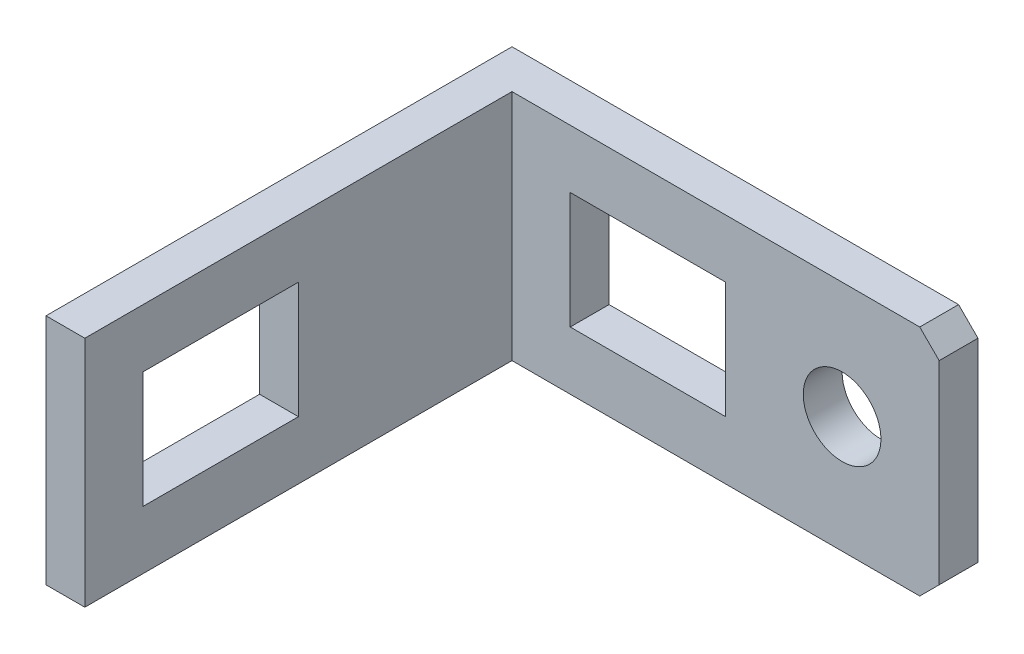
ISO-10303-21;
HEADER;
FILE_DESCRIPTION(('STEP AP214'),'2;1');
FILE_NAME('part.step','',(''),(''),'','','');
FILE_SCHEMA(('AUTOMOTIVE_DESIGN { 1 0 10303 214 1 1 1 1 }'));
ENDSEC;
DATA;
#1=APPLICATION_CONTEXT('core data for automotive mechanical design processes');
#2=APPLICATION_PROTOCOL_DEFINITION('international standard','automotive_design',2000,#1);
#3=PRODUCT_CONTEXT('',#1,'mechanical');
#4=PRODUCT('Part','Part','',(#3));
#5=PRODUCT_RELATED_PRODUCT_CATEGORY('part','',(#4));
#6=PRODUCT_DEFINITION_FORMATION('','',#4);
#7=PRODUCT_DEFINITION_CONTEXT('part definition',#1,'design');
#8=PRODUCT_DEFINITION('design','',#6,#7);
#9=PRODUCT_DEFINITION_SHAPE('','',#8);
#10=(LENGTH_UNIT() NAMED_UNIT(*) SI_UNIT(.MILLI.,.METRE.));
#11=(NAMED_UNIT(*) PLANE_ANGLE_UNIT() SI_UNIT($,.RADIAN.));
#12=(NAMED_UNIT(*) SI_UNIT($,.STERADIAN.) SOLID_ANGLE_UNIT());
#13=UNCERTAINTY_MEASURE_WITH_UNIT(LENGTH_MEASURE(1.E-05),#10,'distance_accuracy_value','');
#14=(GEOMETRIC_REPRESENTATION_CONTEXT(3) GLOBAL_UNCERTAINTY_ASSIGNED_CONTEXT((#13)) GLOBAL_UNIT_ASSIGNED_CONTEXT((#10,
#11,#12)) REPRESENTATION_CONTEXT('',''));
#15=CARTESIAN_POINT('',(0.,0.,0.));
#16=DIRECTION('',(0.,0.,1.));
#17=DIRECTION('',(1.,0.,0.));
#18=AXIS2_PLACEMENT_3D('',#15,#16,#17);
#19=CARTESIAN_POINT('',(-31.75,19.05,0.));
#20=DIRECTION('',(1.,0.,0.));
#21=DIRECTION('',(0.,0.,-1.));
#22=AXIS2_PLACEMENT_3D('',#19,#20,#21);
#23=PLANE('',#22);
#24=DIRECTION('',(0.,1.,0.));
#25=VECTOR('',#24,1.);
#26=CARTESIAN_POINT('',(-31.75,9.525,38.1));
#27=LINE('',#26,#25);
#28=CARTESIAN_POINT('',(-31.75,-9.525,38.1));
#29=VERTEX_POINT('',#28);
#30=CARTESIAN_POINT('',(-31.75,9.525,38.1));
#31=VERTEX_POINT('',#30);
#32=EDGE_CURVE('E53',#29,#31,#27,.T.);
#33=ORIENTED_EDGE('',*,*,#32,.F.);
#34=DIRECTION('',(0.,0.,-1.));
#35=VECTOR('',#34,1.);
#36=CARTESIAN_POINT('',(-31.75,-9.525,63.5));
#37=LINE('',#36,#35);
#38=CARTESIAN_POINT('',(-31.75,-9.525,63.5));
#39=VERTEX_POINT('',#38);
#40=EDGE_CURVE('E169',#39,#29,#37,.T.);
#41=ORIENTED_EDGE('',*,*,#40,.F.);
#42=DIRECTION('',(0.,-1.,0.));
#43=VECTOR('',#42,1.);
#44=CARTESIAN_POINT('',(-31.75,9.525,63.5));
#45=LINE('',#44,#43);
#46=CARTESIAN_POINT('',(-31.75,9.525,63.5));
#47=VERTEX_POINT('',#46);
#48=EDGE_CURVE('E154',#47,#39,#45,.T.);
#49=ORIENTED_EDGE('',*,*,#48,.F.);
#50=DIRECTION('',(0.,0.,1.));
#51=VECTOR('',#50,1.);
#52=CARTESIAN_POINT('',(-31.75,9.525,63.5));
#53=LINE('',#52,#51);
#54=EDGE_CURVE('E163',#31,#47,#53,.T.);
#55=ORIENTED_EDGE('',*,*,#54,.F.);
#56=EDGE_LOOP('',(#33,#41,#49,#55));
#57=FACE_BOUND('',#56,.T.);
#58=DIRECTION('',(0.,0.,1.));
#59=VECTOR('',#58,1.);
#60=CARTESIAN_POINT('',(-31.75,-19.05,0.));
#61=LINE('',#60,#59);
#62=CARTESIAN_POINT('',(-31.75,-19.05,3.17500000000001));
#63=VERTEX_POINT('',#62);
#64=CARTESIAN_POINT('',(-31.75,-19.05,73.025));
#65=VERTEX_POINT('',#64);
#66=EDGE_CURVE('E239',#63,#65,#61,.T.);
#67=ORIENTED_EDGE('',*,*,#66,.F.);
#68=DIRECTION('',(0.,-1.,0.));
#69=VECTOR('',#68,1.);
#70=CARTESIAN_POINT('',(-31.75,19.05,3.17500000000001));
#71=LINE('',#70,#69);
#72=CARTESIAN_POINT('',(-31.75,19.05,3.17500000000001));
#73=VERTEX_POINT('',#72);
#74=EDGE_CURVE('E11',#73,#63,#71,.T.);
#75=ORIENTED_EDGE('',*,*,#74,.F.);
#76=DIRECTION('',(0.,0.,1.));
#77=VECTOR('',#76,1.);
#78=CARTESIAN_POINT('',(-31.75,19.05,0.));
#79=LINE('',#78,#77);
#80=CARTESIAN_POINT('',(-31.75,19.05,73.025));
#81=VERTEX_POINT('',#80);
#82=EDGE_CURVE('E240',#73,#81,#79,.T.);
#83=ORIENTED_EDGE('',*,*,#82,.T.);
#84=DIRECTION('',(0.,-1.,0.));
#85=VECTOR('',#84,1.);
#86=CARTESIAN_POINT('',(-31.75,19.05,73.025));
#87=LINE('',#86,#85);
#88=EDGE_CURVE('E253',#81,#65,#87,.T.);
#89=ORIENTED_EDGE('',*,*,#88,.T.);
#90=EDGE_LOOP('',(#67,#75,#83,#89));
#91=FACE_BOUND('',#90,.T.);
#92=ADVANCED_FACE('F39',(#57,#91),#23,.T.);
#93=CARTESIAN_POINT('',(0.,19.05,3.175));
#94=DIRECTION('',(0.,0.,1.));
#95=DIRECTION('',(1.,0.,0.));
#96=AXIS2_PLACEMENT_3D('',#93,#94,#95);
#97=PLANE('',#96);
#98=DIRECTION('',(-0.707106781186547,0.707106781186548,0.));
#99=VECTOR('',#98,1.);
#100=CARTESIAN_POINT('',(34.925,19.05,3.175));
#101=LINE('',#100,#99);
#102=CARTESIAN_POINT('',(38.1,15.875,3.175));
#103=VERTEX_POINT('',#102);
#104=CARTESIAN_POINT('',(34.925,19.05,3.175));
#105=VERTEX_POINT('',#104);
#106=EDGE_CURVE('E186',#103,#105,#101,.T.);
#107=ORIENTED_EDGE('',*,*,#106,.T.);
#108=DIRECTION('',(-1.,0.,0.));
#109=VECTOR('',#108,1.);
#110=CARTESIAN_POINT('',(0.,19.05,3.175));
#111=LINE('',#110,#109);
#112=EDGE_CURVE('E243',#105,#73,#111,.T.);
#113=ORIENTED_EDGE('',*,*,#112,.T.);
#114=ORIENTED_EDGE('',*,*,#74,.T.);
#115=DIRECTION('',(-1.,0.,0.));
#116=VECTOR('',#115,1.);
#117=CARTESIAN_POINT('',(0.,-19.05,3.175));
#118=LINE('',#117,#116);
#119=CARTESIAN_POINT('',(34.925,-19.05,3.175));
#120=VERTEX_POINT('',#119);
#121=EDGE_CURVE('E256',#120,#63,#118,.T.);
#122=ORIENTED_EDGE('',*,*,#121,.F.);
#123=DIRECTION('',(0.707106781186547,0.707106781186548,0.));
#124=VECTOR('',#123,1.);
#125=CARTESIAN_POINT('',(34.925,-19.05,3.175));
#126=LINE('',#125,#124);
#127=CARTESIAN_POINT('',(38.1,-15.875,3.175));
#128=VERTEX_POINT('',#127);
#129=EDGE_CURVE('E198',#120,#128,#126,.T.);
#130=ORIENTED_EDGE('',*,*,#129,.T.);
#131=DIRECTION('',(0.,-1.,0.));
#132=VECTOR('',#131,1.);
#133=CARTESIAN_POINT('',(38.1,19.05,3.175));
#134=LINE('',#133,#132);
#135=EDGE_CURVE('E46',#103,#128,#134,.T.);
#136=ORIENTED_EDGE('',*,*,#135,.F.);
#137=EDGE_LOOP('',(#107,#113,#114,#122,#130,#136));
#138=FACE_BOUND('',#137,.T.);
#139=DIRECTION('',(-1.,0.,0.));
#140=VECTOR('',#139,1.);
#141=CARTESIAN_POINT('',(-22.225,-9.52499999999999,3.17500000000001));
#142=LINE('',#141,#140);
#143=CARTESIAN_POINT('',(3.175,-9.525,3.175));
#144=VERTEX_POINT('',#143);
#145=CARTESIAN_POINT('',(-22.225,-9.52499999999999,3.17500000000003));
#146=VERTEX_POINT('',#145);
#147=EDGE_CURVE('E204',#144,#146,#142,.T.);
#148=ORIENTED_EDGE('',*,*,#147,.T.);
#149=DIRECTION('',(0.,1.,0.));
#150=VECTOR('',#149,1.);
#151=CARTESIAN_POINT('',(-22.225,9.52500000000001,3.175));
#152=LINE('',#151,#150);
#153=CARTESIAN_POINT('',(-22.225,9.52500000000001,3.175));
#154=VERTEX_POINT('',#153);
#155=EDGE_CURVE('E225',#146,#154,#152,.T.);
#156=ORIENTED_EDGE('',*,*,#155,.T.);
#157=DIRECTION('',(1.,0.,0.));
#158=VECTOR('',#157,1.);
#159=CARTESIAN_POINT('',(-22.225,9.52500000000001,3.17500000000001));
#160=LINE('',#159,#158);
#161=CARTESIAN_POINT('',(3.175,9.525,3.17500000000001));
#162=VERTEX_POINT('',#161);
#163=EDGE_CURVE('E221',#154,#162,#160,.T.);
#164=ORIENTED_EDGE('',*,*,#163,.T.);
#165=DIRECTION('',(0.,-1.,0.));
#166=VECTOR('',#165,1.);
#167=CARTESIAN_POINT('',(3.175,9.525,3.175));
#168=LINE('',#167,#166);
#169=EDGE_CURVE('E216',#162,#144,#168,.T.);
#170=ORIENTED_EDGE('',*,*,#169,.T.);
#171=EDGE_LOOP('',(#148,#156,#164,#170));
#172=FACE_BOUND('',#171,.T.);
#173=CARTESIAN_POINT('',(22.225,0.,3.175));
#174=DIRECTION('',(0.,0.,1.));
#175=DIRECTION('',(1.,0.,0.));
#176=AXIS2_PLACEMENT_3D('',#173,#174,#175);
#177=CIRCLE('',#176,6.35);
#178=CARTESIAN_POINT('',(15.875,0.,3.175));
#179=VERTEX_POINT('',#178);
#180=EDGE_CURVE('E236',#179,#179,#177,.F.);
#181=ORIENTED_EDGE('',*,*,#180,.T.);
#182=EDGE_LOOP('',(#181));
#183=FACE_BOUND('',#182,.T.);
#184=ADVANCED_FACE('F280',(#138,#172,#183),#97,.T.);
#185=CARTESIAN_POINT('',(38.1,19.05,0.));
#186=DIRECTION('',(1.,0.,0.));
#187=DIRECTION('',(0.,0.,-1.));
#188=AXIS2_PLACEMENT_3D('',#185,#186,#187);
#189=PLANE('',#188);
#190=DIRECTION('',(0.,0.,-1.));
#191=VECTOR('',#190,1.);
#192=CARTESIAN_POINT('',(38.1,15.875,7.66512806053457));
#193=LINE('',#192,#191);
#194=CARTESIAN_POINT('',(38.1,15.875,-3.175));
#195=VERTEX_POINT('',#194);
#196=EDGE_CURVE('E184',#103,#195,#193,.T.);
#197=ORIENTED_EDGE('',*,*,#196,.F.);
#198=ORIENTED_EDGE('',*,*,#135,.T.);
#199=DIRECTION('',(0.,0.,-1.));
#200=VECTOR('',#199,1.);
#201=CARTESIAN_POINT('',(38.1,-15.875,7.66512806053457));
#202=LINE('',#201,#200);
#203=CARTESIAN_POINT('',(38.1,-15.875,-3.175));
#204=VERTEX_POINT('',#203);
#205=EDGE_CURVE('E195',#128,#204,#202,.T.);
#206=ORIENTED_EDGE('',*,*,#205,.T.);
#207=DIRECTION('',(0.,-1.,0.));
#208=VECTOR('',#207,1.);
#209=CARTESIAN_POINT('',(38.1,19.05,-3.175));
#210=LINE('',#209,#208);
#211=EDGE_CURVE('E271',#195,#204,#210,.T.);
#212=ORIENTED_EDGE('',*,*,#211,.F.);
#213=EDGE_LOOP('',(#197,#198,#206,#212));
#214=FACE_BOUND('',#213,.T.);
#215=ADVANCED_FACE('F277',(#214),#189,.T.);
#216=CARTESIAN_POINT('',(0.,19.05,-3.175));
#217=DIRECTION('',(0.,0.,1.));
#218=DIRECTION('',(1.,0.,0.));
#219=AXIS2_PLACEMENT_3D('',#216,#217,#218);
#220=PLANE('',#219);
#221=DIRECTION('',(0.,1.,0.));
#222=VECTOR('',#221,1.);
#223=CARTESIAN_POINT('',(-22.225,9.52500000000001,-3.175));
#224=LINE('',#223,#222);
#225=CARTESIAN_POINT('',(-22.225,-9.52499999999999,-3.175));
#226=VERTEX_POINT('',#225);
#227=CARTESIAN_POINT('',(-22.225,9.52500000000001,-3.175));
#228=VERTEX_POINT('',#227);
#229=EDGE_CURVE('E205',#226,#228,#224,.T.);
#230=ORIENTED_EDGE('',*,*,#229,.F.);
#231=DIRECTION('',(-1.,0.,0.));
#232=VECTOR('',#231,1.);
#233=CARTESIAN_POINT('',(-22.225,-9.52499999999999,-3.175));
#234=LINE('',#233,#232);
#235=CARTESIAN_POINT('',(3.175,-9.525,-3.175));
#236=VERTEX_POINT('',#235);
#237=EDGE_CURVE('E208',#236,#226,#234,.T.);
#238=ORIENTED_EDGE('',*,*,#237,.F.);
#239=DIRECTION('',(0.,-1.,0.));
#240=VECTOR('',#239,1.);
#241=CARTESIAN_POINT('',(3.175,9.525,-3.175));
#242=LINE('',#241,#240);
#243=CARTESIAN_POINT('',(3.175,9.525,-3.175));
#244=VERTEX_POINT('',#243);
#245=EDGE_CURVE('E192',#244,#236,#242,.T.);
#246=ORIENTED_EDGE('',*,*,#245,.F.);
#247=DIRECTION('',(1.,0.,0.));
#248=VECTOR('',#247,1.);
#249=CARTESIAN_POINT('',(-22.225,9.52500000000001,-3.175));
#250=LINE('',#249,#248);
#251=EDGE_CURVE('E202',#228,#244,#250,.T.);
#252=ORIENTED_EDGE('',*,*,#251,.F.);
#253=EDGE_LOOP('',(#230,#238,#246,#252));
#254=FACE_BOUND('',#253,.T.);
#255=CARTESIAN_POINT('',(22.225,0.,-3.175));
#256=DIRECTION('',(0.,0.,-1.));
#257=DIRECTION('',(-1.,0.,0.));
#258=AXIS2_PLACEMENT_3D('',#255,#256,#257);
#259=CIRCLE('',#258,6.35);
#260=CARTESIAN_POINT('',(15.875,0.,-3.175));
#261=VERTEX_POINT('',#260);
#262=EDGE_CURVE('E233',#261,#261,#259,.T.);
#263=ORIENTED_EDGE('',*,*,#262,.F.);
#264=EDGE_LOOP('',(#263));
#265=FACE_BOUND('',#264,.T.);
#266=DIRECTION('',(-1.,0.,0.));
#267=VECTOR('',#266,1.);
#268=CARTESIAN_POINT('',(0.,19.05,-3.175));
#269=LINE('',#268,#267);
#270=CARTESIAN_POINT('',(34.925,19.05,-3.175));
#271=VERTEX_POINT('',#270);
#272=CARTESIAN_POINT('',(-38.1,19.05,-3.17499999999999));
#273=VERTEX_POINT('',#272);
#274=EDGE_CURVE('E246',#271,#273,#269,.T.);
#275=ORIENTED_EDGE('',*,*,#274,.F.);
#276=DIRECTION('',(-0.707106781186547,0.707106781186548,0.));
#277=VECTOR('',#276,1.);
#278=CARTESIAN_POINT('',(34.925,19.05,-3.175));
#279=LINE('',#278,#277);
#280=EDGE_CURVE('E182',#195,#271,#279,.T.);
#281=ORIENTED_EDGE('',*,*,#280,.F.);
#282=ORIENTED_EDGE('',*,*,#211,.T.);
#283=DIRECTION('',(0.707106781186547,0.707106781186548,0.));
#284=VECTOR('',#283,1.);
#285=CARTESIAN_POINT('',(34.925,-19.05,-3.175));
#286=LINE('',#285,#284);
#287=CARTESIAN_POINT('',(34.925,-19.05,-3.175));
#288=VERTEX_POINT('',#287);
#289=EDGE_CURVE('E185',#288,#204,#286,.T.);
#290=ORIENTED_EDGE('',*,*,#289,.F.);
#291=DIRECTION('',(-1.,0.,0.));
#292=VECTOR('',#291,1.);
#293=CARTESIAN_POINT('',(0.,-19.05,-3.175));
#294=LINE('',#293,#292);
#295=CARTESIAN_POINT('',(-38.1,-19.05,-3.17499999999999));
#296=VERTEX_POINT('',#295);
#297=EDGE_CURVE('E258',#288,#296,#294,.T.);
#298=ORIENTED_EDGE('',*,*,#297,.T.);
#299=DIRECTION('',(0.,-1.,0.));
#300=VECTOR('',#299,1.);
#301=CARTESIAN_POINT('',(-38.1,19.05,-3.17499999999999));
#302=LINE('',#301,#300);
#303=EDGE_CURVE('E268',#273,#296,#302,.T.);
#304=ORIENTED_EDGE('',*,*,#303,.F.);
#305=EDGE_LOOP('',(#275,#281,#282,#290,#298,#304));
#306=FACE_BOUND('',#305,.T.);
#307=ADVANCED_FACE('F295',(#254,#265,#306),#220,.F.);
#308=CARTESIAN_POINT('',(-38.1,19.05,0.));
#309=DIRECTION('',(1.,0.,0.));
#310=DIRECTION('',(0.,0.,-1.));
#311=AXIS2_PLACEMENT_3D('',#308,#309,#310);
#312=PLANE('',#311);
#313=DIRECTION('',(0.,0.,1.));
#314=VECTOR('',#313,1.);
#315=CARTESIAN_POINT('',(-38.1,-9.525,63.5));
#316=LINE('',#315,#314);
#317=CARTESIAN_POINT('',(-38.1,-9.525,38.1));
#318=VERTEX_POINT('',#317);
#319=CARTESIAN_POINT('',(-38.1,-9.52499999999999,63.5));
#320=VERTEX_POINT('',#319);
#321=EDGE_CURVE('E539',#318,#320,#316,.T.);
#322=ORIENTED_EDGE('',*,*,#321,.F.);
#323=DIRECTION('',(0.,-1.,0.));
#324=VECTOR('',#323,1.);
#325=CARTESIAN_POINT('',(-38.1,9.525,38.1));
#326=LINE('',#325,#324);
#327=CARTESIAN_POINT('',(-38.1,9.525,38.1));
#328=VERTEX_POINT('',#327);
#329=EDGE_CURVE('E181',#328,#318,#326,.T.);
#330=ORIENTED_EDGE('',*,*,#329,.F.);
#331=DIRECTION('',(0.,0.,-1.));
#332=VECTOR('',#331,1.);
#333=CARTESIAN_POINT('',(-38.1,9.525,63.5));
#334=LINE('',#333,#332);
#335=CARTESIAN_POINT('',(-38.1,9.525,63.5));
#336=VERTEX_POINT('',#335);
#337=EDGE_CURVE('E178',#336,#328,#334,.T.);
#338=ORIENTED_EDGE('',*,*,#337,.F.);
#339=DIRECTION('',(0.,1.,0.));
#340=VECTOR('',#339,1.);
#341=CARTESIAN_POINT('',(-38.1,9.525,63.5));
#342=LINE('',#341,#340);
#343=EDGE_CURVE('E157',#320,#336,#342,.T.);
#344=ORIENTED_EDGE('',*,*,#343,.F.);
#345=EDGE_LOOP('',(#322,#330,#338,#344));
#346=FACE_BOUND('',#345,.T.);
#347=DIRECTION('',(0.,0.,1.));
#348=VECTOR('',#347,1.);
#349=CARTESIAN_POINT('',(-38.1,-19.05,0.));
#350=LINE('',#349,#348);
#351=CARTESIAN_POINT('',(-38.1,-19.05,73.025));
#352=VERTEX_POINT('',#351);
#353=EDGE_CURVE('E260',#296,#352,#350,.T.);
#354=ORIENTED_EDGE('',*,*,#353,.T.);
#355=DIRECTION('',(0.,-1.,0.));
#356=VECTOR('',#355,1.);
#357=CARTESIAN_POINT('',(-38.1,19.05,73.025));
#358=LINE('',#357,#356);
#359=CARTESIAN_POINT('',(-38.1,19.05,73.025));
#360=VERTEX_POINT('',#359);
#361=EDGE_CURVE('E266',#360,#352,#358,.T.);
#362=ORIENTED_EDGE('',*,*,#361,.F.);
#363=DIRECTION('',(0.,0.,1.));
#364=VECTOR('',#363,1.);
#365=CARTESIAN_POINT('',(-38.1,19.05,0.));
#366=LINE('',#365,#364);
#367=EDGE_CURVE('E248',#273,#360,#366,.T.);
#368=ORIENTED_EDGE('',*,*,#367,.F.);
#369=ORIENTED_EDGE('',*,*,#303,.T.);
#370=EDGE_LOOP('',(#354,#362,#368,#369));
#371=FACE_BOUND('',#370,.T.);
#372=ADVANCED_FACE('F298',(#346,#371),#312,.F.);
#373=CARTESIAN_POINT('',(0.,19.05,73.025));
#374=DIRECTION('',(0.,0.,1.));
#375=DIRECTION('',(1.,0.,0.));
#376=AXIS2_PLACEMENT_3D('',#373,#374,#375);
#377=PLANE('',#376);
#378=DIRECTION('',(-1.,0.,0.));
#379=VECTOR('',#378,1.);
#380=CARTESIAN_POINT('',(0.,-19.05,73.025));
#381=LINE('',#380,#379);
#382=EDGE_CURVE('E244',#65,#352,#381,.T.);
#383=ORIENTED_EDGE('',*,*,#382,.F.);
#384=ORIENTED_EDGE('',*,*,#88,.F.);
#385=DIRECTION('',(-1.,0.,0.));
#386=VECTOR('',#385,1.);
#387=CARTESIAN_POINT('',(0.,19.05,73.025));
#388=LINE('',#387,#386);
#389=EDGE_CURVE('E250',#81,#360,#388,.T.);
#390=ORIENTED_EDGE('',*,*,#389,.T.);
#391=ORIENTED_EDGE('',*,*,#361,.T.);
#392=EDGE_LOOP('',(#383,#384,#390,#391));
#393=FACE_BOUND('',#392,.T.);
#394=ADVANCED_FACE('F332',(#393),#377,.T.);
#395=CARTESIAN_POINT('',(0.,19.05,0.));
#396=DIRECTION('',(0.,1.,0.));
#397=DIRECTION('',(0.,0.,1.));
#398=AXIS2_PLACEMENT_3D('',#395,#396,#397);
#399=PLANE('',#398);
#400=DIRECTION('',(0.,0.,-1.));
#401=VECTOR('',#400,1.);
#402=CARTESIAN_POINT('',(34.925,19.05,7.66512806053457));
#403=LINE('',#402,#401);
#404=EDGE_CURVE('E189',#105,#271,#403,.T.);
#405=ORIENTED_EDGE('',*,*,#404,.T.);
#406=ORIENTED_EDGE('',*,*,#274,.T.);
#407=ORIENTED_EDGE('',*,*,#367,.T.);
#408=ORIENTED_EDGE('',*,*,#389,.F.);
#409=ORIENTED_EDGE('',*,*,#82,.F.);
#410=ORIENTED_EDGE('',*,*,#112,.F.);
#411=EDGE_LOOP('',(#405,#406,#407,#408,#409,#410));
#412=FACE_BOUND('',#411,.T.);
#413=ADVANCED_FACE('F302',(#412),#399,.T.);
#414=CARTESIAN_POINT('',(0.,-19.05,0.));
#415=DIRECTION('',(0.,1.,0.));
#416=DIRECTION('',(0.,0.,1.));
#417=AXIS2_PLACEMENT_3D('',#414,#415,#416);
#418=PLANE('',#417);
#419=ORIENTED_EDGE('',*,*,#297,.F.);
#420=DIRECTION('',(0.,0.,-1.));
#421=VECTOR('',#420,1.);
#422=CARTESIAN_POINT('',(34.925,-19.05,7.66512806053457));
#423=LINE('',#422,#421);
#424=EDGE_CURVE('E180',#120,#288,#423,.T.);
#425=ORIENTED_EDGE('',*,*,#424,.F.);
#426=ORIENTED_EDGE('',*,*,#121,.T.);
#427=ORIENTED_EDGE('',*,*,#66,.T.);
#428=ORIENTED_EDGE('',*,*,#382,.T.);
#429=ORIENTED_EDGE('',*,*,#353,.F.);
#430=EDGE_LOOP('',(#419,#425,#426,#427,#428,#429));
#431=FACE_BOUND('',#430,.T.);
#432=ADVANCED_FACE('F290',(#431),#418,.F.);
#433=CARTESIAN_POINT('',(22.225,0.,21.1355122421383));
#434=DIRECTION('',(0.,0.,-1.));
#435=DIRECTION('',(-1.,0.,0.));
#436=AXIS2_PLACEMENT_3D('',#433,#434,#435);
#437=CYLINDRICAL_SURFACE('',#436,6.35);
#438=CARTESIAN_POINT('',(15.875,0.,-3.175));
#439=CARTESIAN_POINT('',(15.875,0.,-3.10885416666667));
#440=CARTESIAN_POINT('',(15.875,0.,-3.04270833333333));
#441=CARTESIAN_POINT('',(15.875,0.,-2.91041666666667));
#442=CARTESIAN_POINT('',(15.875,0.,-2.84427083333333));
#443=CARTESIAN_POINT('',(15.875,0.,-2.71197916666667));
#444=CARTESIAN_POINT('',(15.875,0.,-2.64583333333333));
#445=CARTESIAN_POINT('',(15.875,0.,-2.51354166666667));
#446=CARTESIAN_POINT('',(15.875,0.,-2.44739583333333));
#447=CARTESIAN_POINT('',(15.875,0.,-2.31510416666667));
#448=CARTESIAN_POINT('',(15.875,0.,-2.24895833333333));
#449=CARTESIAN_POINT('',(15.875,0.,-2.11666666666667));
#450=CARTESIAN_POINT('',(15.875,0.,-2.05052083333333));
#451=CARTESIAN_POINT('',(15.875,0.,-1.91822916666667));
#452=CARTESIAN_POINT('',(15.875,0.,-1.85208333333333));
#453=CARTESIAN_POINT('',(15.875,0.,-1.71979166666667));
#454=CARTESIAN_POINT('',(15.875,0.,-1.65364583333334));
#455=CARTESIAN_POINT('',(15.875,0.,-1.52135416666667));
#456=CARTESIAN_POINT('',(15.875,0.,-1.45520833333333));
#457=CARTESIAN_POINT('',(15.875,0.,-1.32291666666667));
#458=CARTESIAN_POINT('',(15.875,0.,-1.25677083333333));
#459=CARTESIAN_POINT('',(15.875,0.,-1.12447916666667));
#460=CARTESIAN_POINT('',(15.875,0.,-1.05833333333333));
#461=CARTESIAN_POINT('',(15.875,0.,-0.926041666666668));
#462=CARTESIAN_POINT('',(15.875,0.,-0.859895833333333));
#463=CARTESIAN_POINT('',(15.875,0.,-0.727604166666666));
#464=CARTESIAN_POINT('',(15.875,0.,-0.661458333333333));
#465=CARTESIAN_POINT('',(15.875,0.,-0.529166666666667));
#466=CARTESIAN_POINT('',(15.875,0.,-0.463020833333334));
#467=CARTESIAN_POINT('',(15.875,0.,-0.330729166666667));
#468=CARTESIAN_POINT('',(15.875,0.,-0.264583333333333));
#469=CARTESIAN_POINT('',(15.875,0.,-0.132291666666666));
#470=CARTESIAN_POINT('',(15.875,0.,-0.066145833333333));
#471=CARTESIAN_POINT('',(15.875,0.,0.066145833333333));
#472=CARTESIAN_POINT('',(15.875,0.,0.132291666666666));
#473=CARTESIAN_POINT('',(15.875,0.,0.264583333333333));
#474=CARTESIAN_POINT('',(15.875,0.,0.330729166666667));
#475=CARTESIAN_POINT('',(15.875,0.,0.463020833333334));
#476=CARTESIAN_POINT('',(15.875,0.,0.529166666666667));
#477=CARTESIAN_POINT('',(15.875,0.,0.661458333333333));
#478=CARTESIAN_POINT('',(15.875,0.,0.727604166666666));
#479=CARTESIAN_POINT('',(15.875,0.,0.859895833333334));
#480=CARTESIAN_POINT('',(15.875,0.,0.926041666666668));
#481=CARTESIAN_POINT('',(15.875,0.,1.05833333333333));
#482=CARTESIAN_POINT('',(15.875,0.,1.12447916666667));
#483=CARTESIAN_POINT('',(15.875,0.,1.25677083333333));
#484=CARTESIAN_POINT('',(15.875,0.,1.32291666666667));
#485=CARTESIAN_POINT('',(15.875,0.,1.45520833333333));
#486=CARTESIAN_POINT('',(15.875,0.,1.52135416666667));
#487=CARTESIAN_POINT('',(15.875,0.,1.65364583333334));
#488=CARTESIAN_POINT('',(15.875,0.,1.71979166666667));
#489=CARTESIAN_POINT('',(15.875,0.,1.85208333333333));
#490=CARTESIAN_POINT('',(15.875,0.,1.91822916666667));
#491=CARTESIAN_POINT('',(15.875,0.,2.05052083333333));
#492=CARTESIAN_POINT('',(15.875,0.,2.11666666666667));
#493=CARTESIAN_POINT('',(15.875,0.,2.24895833333334));
#494=CARTESIAN_POINT('',(15.875,0.,2.31510416666667));
#495=CARTESIAN_POINT('',(15.875,0.,2.44739583333333));
#496=CARTESIAN_POINT('',(15.875,0.,2.51354166666667));
#497=CARTESIAN_POINT('',(15.875,0.,2.64583333333333));
#498=CARTESIAN_POINT('',(15.875,0.,2.71197916666667));
#499=CARTESIAN_POINT('',(15.875,0.,2.84427083333334));
#500=CARTESIAN_POINT('',(15.875,0.,2.91041666666667));
#501=CARTESIAN_POINT('',(15.875,0.,3.04270833333333));
#502=CARTESIAN_POINT('',(15.875,0.,3.10885416666667));
#503=CARTESIAN_POINT('',(15.875,0.,3.175));
#504=B_SPLINE_CURVE_WITH_KNOTS('',3,(#438,#439,#440,#441,#442,#443,#444,#445,#446,#447,#448,
#449,#450,#451,#452,#453,#454,#455,#456,#457,#458,#459,#460,#461,#462,#463,#464,#465,#466,#467,
#468,#469,#470,#471,#472,#473,#474,#475,#476,#477,#478,#479,#480,#481,#482,#483,#484,#485,#486,
#487,#488,#489,#490,#491,#492,#493,#494,#495,#496,#497,#498,#499,#500,#501,#502,#503),
.UNSPECIFIED.,.F.,.F.,(4,2,2,2,2,2,2,2,2,2,2,2,2,2,2,2,2,2,2,2,2,2,2,2,2,2,2,2,2,2,2,2,4),(0.,
0.198437499999999,0.396875000000001,0.5953125,0.793749999999999,0.992187500000002,1.190625,
1.3890625,1.5875,1.7859375,1.984375,2.1828125,2.38125,2.5796875,2.778125,2.9765625,3.175,
3.3734375,3.571875,3.7703125,3.96875,4.1671875,4.365625,4.5640625,4.7625,4.9609375,5.159375,
5.3578125,5.55625,5.7546875,5.953125,6.1515625,6.35),.UNSPECIFIED.);
#505=EDGE_CURVE('BSEAM339',#261,#179,#504,.T.);
#506=ORIENTED_EDGE('',*,*,#262,.T.);
#507=ORIENTED_EDGE('',*,*,#180,.F.);
#508=ORIENTED_EDGE('',*,*,#505,.T.);
#509=ORIENTED_EDGE('',*,*,#505,.F.);
#510=EDGE_LOOP('',(#506,#508,#507,#509));
#511=FACE_BOUND('',#510,.T.);
#512=ADVANCED_FACE('F339',(#511),#437,.F.);
#513=CARTESIAN_POINT('',(-22.225,-9.52499999999999,34.925));
#514=DIRECTION('',(0.,-1.,0.));
#515=DIRECTION('',(1.,0.,0.));
#516=AXIS2_PLACEMENT_3D('',#513,#514,#515);
#517=PLANE('',#516);
#518=DIRECTION('',(0.,0.,-1.));
#519=VECTOR('',#518,1.);
#520=CARTESIAN_POINT('',(3.175,-9.525,34.925));
#521=LINE('',#520,#519);
#522=EDGE_CURVE('E219',#144,#236,#521,.T.);
#523=ORIENTED_EDGE('',*,*,#522,.T.);
#524=ORIENTED_EDGE('',*,*,#237,.T.);
#525=DIRECTION('',(0.,0.,-1.));
#526=VECTOR('',#525,1.);
#527=CARTESIAN_POINT('',(-22.225,-9.52499999999999,34.925));
#528=LINE('',#527,#526);
#529=EDGE_CURVE('E215',#146,#226,#528,.T.);
#530=ORIENTED_EDGE('',*,*,#529,.F.);
#531=ORIENTED_EDGE('',*,*,#147,.F.);
#532=EDGE_LOOP('',(#523,#524,#530,#531));
#533=FACE_BOUND('',#532,.T.);
#534=ADVANCED_FACE('F344',(#533),#517,.F.);
#535=CARTESIAN_POINT('',(-22.225,9.52500000000001,34.925));
#536=DIRECTION('',(-1.,0.,0.));
#537=DIRECTION('',(0.,-1.,0.));
#538=AXIS2_PLACEMENT_3D('',#535,#536,#537);
#539=PLANE('',#538);
#540=ORIENTED_EDGE('',*,*,#529,.T.);
#541=ORIENTED_EDGE('',*,*,#229,.T.);
#542=DIRECTION('',(0.,0.,-1.));
#543=VECTOR('',#542,1.);
#544=CARTESIAN_POINT('',(-22.225,9.52500000000001,34.925));
#545=LINE('',#544,#543);
#546=EDGE_CURVE('E224',#154,#228,#545,.T.);
#547=ORIENTED_EDGE('',*,*,#546,.F.);
#548=ORIENTED_EDGE('',*,*,#155,.F.);
#549=EDGE_LOOP('',(#540,#541,#547,#548));
#550=FACE_BOUND('',#549,.T.);
#551=ADVANCED_FACE('F348',(#550),#539,.F.);
#552=CARTESIAN_POINT('',(-22.225,9.52500000000001,34.925));
#553=DIRECTION('',(0.,1.,0.));
#554=DIRECTION('',(-1.,0.,0.));
#555=AXIS2_PLACEMENT_3D('',#552,#553,#554);
#556=PLANE('',#555);
#557=ORIENTED_EDGE('',*,*,#546,.T.);
#558=ORIENTED_EDGE('',*,*,#251,.T.);
#559=DIRECTION('',(0.,0.,-1.));
#560=VECTOR('',#559,1.);
#561=CARTESIAN_POINT('',(3.175,9.525,34.925));
#562=LINE('',#561,#560);
#563=EDGE_CURVE('E220',#162,#244,#562,.T.);
#564=ORIENTED_EDGE('',*,*,#563,.F.);
#565=ORIENTED_EDGE('',*,*,#163,.F.);
#566=EDGE_LOOP('',(#557,#558,#564,#565));
#567=FACE_BOUND('',#566,.T.);
#568=ADVANCED_FACE('F352',(#567),#556,.F.);
#569=CARTESIAN_POINT('',(3.175,9.525,34.925));
#570=DIRECTION('',(1.,0.,0.));
#571=DIRECTION('',(0.,1.,0.));
#572=AXIS2_PLACEMENT_3D('',#569,#570,#571);
#573=PLANE('',#572);
#574=ORIENTED_EDGE('',*,*,#563,.T.);
#575=ORIENTED_EDGE('',*,*,#245,.T.);
#576=ORIENTED_EDGE('',*,*,#522,.F.);
#577=ORIENTED_EDGE('',*,*,#169,.F.);
#578=EDGE_LOOP('',(#574,#575,#576,#577));
#579=FACE_BOUND('',#578,.T.);
#580=ADVANCED_FACE('F316',(#579),#573,.F.);
#581=CARTESIAN_POINT('',(34.925,-19.05,7.66512806053457));
#582=DIRECTION('',(-0.707106781186548,0.707106781186547,0.));
#583=DIRECTION('',(-0.707106781186547,-0.707106781186548,0.));
#584=AXIS2_PLACEMENT_3D('',#581,#582,#583);
#585=PLANE('',#584);
#586=ORIENTED_EDGE('',*,*,#424,.T.);
#587=ORIENTED_EDGE('',*,*,#289,.T.);
#588=ORIENTED_EDGE('',*,*,#205,.F.);
#589=ORIENTED_EDGE('',*,*,#129,.F.);
#590=EDGE_LOOP('',(#586,#587,#588,#589));
#591=FACE_BOUND('',#590,.T.);
#592=ADVANCED_FACE('F286',(#591),#585,.F.);
#593=CARTESIAN_POINT('',(34.925,19.05,7.66512806053457));
#594=DIRECTION('',(-0.707106781186548,-0.707106781186547,0.));
#595=DIRECTION('',(0.707106781186547,-0.707106781186548,0.));
#596=AXIS2_PLACEMENT_3D('',#593,#594,#595);
#597=PLANE('',#596);
#598=ORIENTED_EDGE('',*,*,#196,.T.);
#599=ORIENTED_EDGE('',*,*,#280,.T.);
#600=ORIENTED_EDGE('',*,*,#404,.F.);
#601=ORIENTED_EDGE('',*,*,#106,.F.);
#602=EDGE_LOOP('',(#598,#599,#600,#601));
#603=FACE_BOUND('',#602,.T.);
#604=ADVANCED_FACE('F306',(#603),#597,.F.);
#605=CARTESIAN_POINT('',(-69.85,9.525,38.1));
#606=DIRECTION('',(0.,0.,-1.));
#607=DIRECTION('',(0.,1.,0.));
#608=AXIS2_PLACEMENT_3D('',#605,#606,#607);
#609=PLANE('',#608);
#610=ORIENTED_EDGE('',*,*,#329,.T.);
#611=DIRECTION('',(1.,0.,0.));
#612=VECTOR('',#611,1.);
#613=CARTESIAN_POINT('',(-69.85,-9.525,38.1));
#614=LINE('',#613,#612);
#615=EDGE_CURVE('E174',#318,#29,#614,.T.);
#616=ORIENTED_EDGE('',*,*,#615,.T.);
#617=ORIENTED_EDGE('',*,*,#32,.T.);
#618=DIRECTION('',(1.,0.,0.));
#619=VECTOR('',#618,1.);
#620=CARTESIAN_POINT('',(-69.85,9.525,38.1));
#621=LINE('',#620,#619);
#622=EDGE_CURVE('E160',#328,#31,#621,.T.);
#623=ORIENTED_EDGE('',*,*,#622,.F.);
#624=EDGE_LOOP('',(#610,#616,#617,#623));
#625=FACE_BOUND('',#624,.T.);
#626=ADVANCED_FACE('F308',(#625),#609,.F.);
#627=CARTESIAN_POINT('',(-69.85,-9.525,63.5));
#628=DIRECTION('',(0.,-1.,0.));
#629=DIRECTION('',(0.,0.,-1.));
#630=AXIS2_PLACEMENT_3D('',#627,#628,#629);
#631=PLANE('',#630);
#632=ORIENTED_EDGE('',*,*,#321,.T.);
#633=DIRECTION('',(1.,0.,0.));
#634=VECTOR('',#633,1.);
#635=CARTESIAN_POINT('',(-69.85,-9.525,63.5));
#636=LINE('',#635,#634);
#637=EDGE_CURVE('E159',#320,#39,#636,.T.);
#638=ORIENTED_EDGE('',*,*,#637,.T.);
#639=ORIENTED_EDGE('',*,*,#40,.T.);
#640=ORIENTED_EDGE('',*,*,#615,.F.);
#641=EDGE_LOOP('',(#632,#638,#639,#640));
#642=FACE_BOUND('',#641,.T.);
#643=ADVANCED_FACE('F314',(#642),#631,.F.);
#644=CARTESIAN_POINT('',(-69.85,9.525,63.5));
#645=DIRECTION('',(0.,0.,1.));
#646=DIRECTION('',(1.,0.,0.));
#647=AXIS2_PLACEMENT_3D('',#644,#645,#646);
#648=PLANE('',#647);
#649=ORIENTED_EDGE('',*,*,#343,.T.);
#650=DIRECTION('',(1.,0.,0.));
#651=VECTOR('',#650,1.);
#652=CARTESIAN_POINT('',(-69.85,9.525,63.5));
#653=LINE('',#652,#651);
#654=EDGE_CURVE('E61',#336,#47,#653,.T.);
#655=ORIENTED_EDGE('',*,*,#654,.T.);
#656=ORIENTED_EDGE('',*,*,#48,.T.);
#657=ORIENTED_EDGE('',*,*,#637,.F.);
#658=EDGE_LOOP('',(#649,#655,#656,#657));
#659=FACE_BOUND('',#658,.T.);
#660=ADVANCED_FACE('F151',(#659),#648,.F.);
#661=CARTESIAN_POINT('',(-69.85,9.525,63.5));
#662=DIRECTION('',(0.,1.,0.));
#663=DIRECTION('',(0.,0.,1.));
#664=AXIS2_PLACEMENT_3D('',#661,#662,#663);
#665=PLANE('',#664);
#666=ORIENTED_EDGE('',*,*,#337,.T.);
#667=ORIENTED_EDGE('',*,*,#622,.T.);
#668=ORIENTED_EDGE('',*,*,#54,.T.);
#669=ORIENTED_EDGE('',*,*,#654,.F.);
#670=EDGE_LOOP('',(#666,#667,#668,#669));
#671=FACE_BOUND('',#670,.T.);
#672=ADVANCED_FACE('F164',(#671),#665,.F.);
#673=CLOSED_SHELL('',(#92,#184,#215,#307,#372,#394,#413,#432,#512,#534,#551,#568,#580,#592,#604,
#626,#643,#660,#672));
#674=MANIFOLD_SOLID_BREP('B2',#673);
#675=ADVANCED_BREP_SHAPE_REPRESENTATION('',(#18,#674),#14);
#676=SHAPE_DEFINITION_REPRESENTATION(#9,#675);
ENDSEC;
END-ISO-10303-21;
